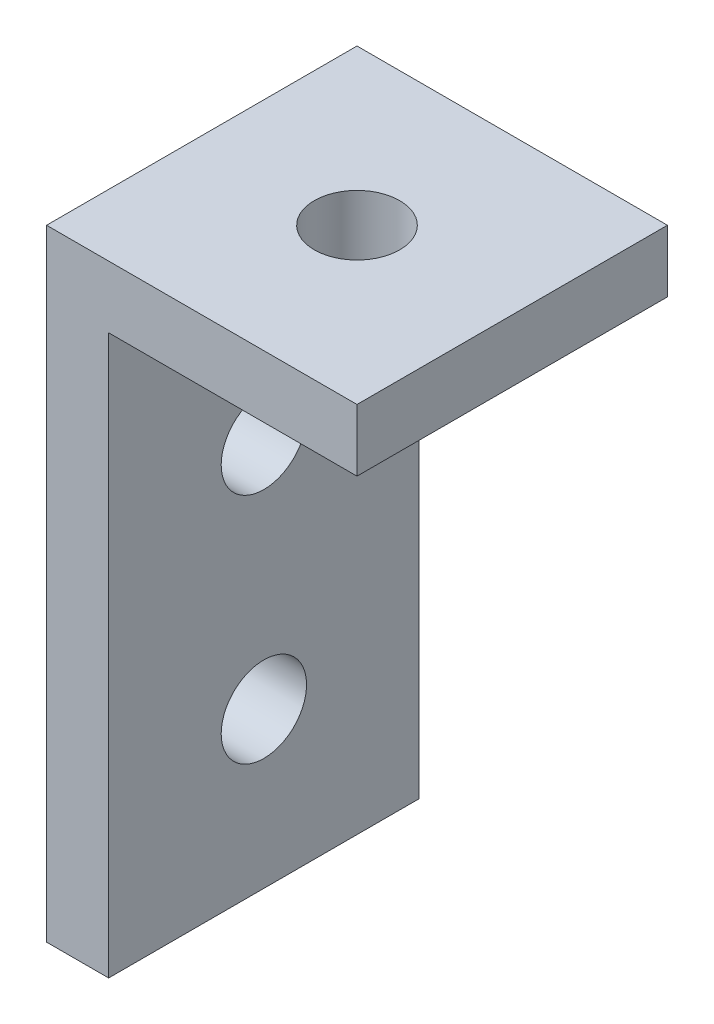
ISO-10303-21;
HEADER;
FILE_DESCRIPTION(('STEP AP214'),'2;1');
FILE_NAME('part.step','',(''),(''),'','','');
FILE_SCHEMA(('AUTOMOTIVE_DESIGN { 1 0 10303 214 1 1 1 1 }'));
ENDSEC;
DATA;
#1=APPLICATION_CONTEXT('core data for automotive mechanical design processes');
#2=APPLICATION_PROTOCOL_DEFINITION('international standard','automotive_design',2000,#1);
#3=PRODUCT_CONTEXT('',#1,'mechanical');
#4=PRODUCT('Part','Part','',(#3));
#5=PRODUCT_RELATED_PRODUCT_CATEGORY('part','',(#4));
#6=PRODUCT_DEFINITION_FORMATION('','',#4);
#7=PRODUCT_DEFINITION_CONTEXT('part definition',#1,'design');
#8=PRODUCT_DEFINITION('design','',#6,#7);
#9=PRODUCT_DEFINITION_SHAPE('','',#8);
#10=(LENGTH_UNIT() NAMED_UNIT(*) SI_UNIT(.MILLI.,.METRE.));
#11=(NAMED_UNIT(*) PLANE_ANGLE_UNIT() SI_UNIT($,.RADIAN.));
#12=(NAMED_UNIT(*) SI_UNIT($,.STERADIAN.) SOLID_ANGLE_UNIT());
#13=UNCERTAINTY_MEASURE_WITH_UNIT(LENGTH_MEASURE(1.E-05),#10,'distance_accuracy_value','');
#14=(GEOMETRIC_REPRESENTATION_CONTEXT(3) GLOBAL_UNCERTAINTY_ASSIGNED_CONTEXT((#13)) GLOBAL_UNIT_ASSIGNED_CONTEXT((#10,
#11,#12)) REPRESENTATION_CONTEXT('',''));
#15=CARTESIAN_POINT('',(0.,0.,0.));
#16=DIRECTION('',(0.,0.,1.));
#17=DIRECTION('',(1.,0.,0.));
#18=AXIS2_PLACEMENT_3D('',#15,#16,#17);
#19=CARTESIAN_POINT('',(0.,40.,20.));
#20=DIRECTION('',(1.,0.,0.));
#21=DIRECTION('',(0.,0.,-1.));
#22=AXIS2_PLACEMENT_3D('',#19,#20,#21);
#23=PLANE('',#22);
#24=CARTESIAN_POINT('',(0.,25.,10.));
#25=DIRECTION('',(-1.,0.,0.));
#26=DIRECTION('',(0.,0.,1.));
#27=AXIS2_PLACEMENT_3D('',#24,#25,#26);
#28=CIRCLE('',#27,2.75);
#29=CARTESIAN_POINT('',(0.,25.,12.75));
#30=VERTEX_POINT('',#29);
#31=EDGE_CURVE('E148',#30,#30,#28,.T.);
#32=ORIENTED_EDGE('',*,*,#31,.F.);
#33=EDGE_LOOP('',(#32));
#34=FACE_BOUND('',#33,.T.);
#35=CARTESIAN_POINT('',(0.,10.,10.));
#36=DIRECTION('',(-1.,0.,0.));
#37=DIRECTION('',(0.,0.,1.));
#38=AXIS2_PLACEMENT_3D('',#35,#36,#37);
#39=CIRCLE('',#38,2.75);
#40=CARTESIAN_POINT('',(0.,10.,12.75));
#41=VERTEX_POINT('',#40);
#42=EDGE_CURVE('E138',#41,#41,#39,.T.);
#43=ORIENTED_EDGE('',*,*,#42,.F.);
#44=EDGE_LOOP('',(#43));
#45=FACE_BOUND('',#44,.T.);
#46=DIRECTION('',(0.,-1.,0.));
#47=VECTOR('',#46,1.);
#48=CARTESIAN_POINT('',(0.,40.,0.));
#49=LINE('',#48,#47);
#50=CARTESIAN_POINT('',(0.,40.,0.));
#51=VERTEX_POINT('',#50);
#52=CARTESIAN_POINT('',(0.,0.,0.));
#53=VERTEX_POINT('',#52);
#54=EDGE_CURVE('E119',#51,#53,#49,.T.);
#55=ORIENTED_EDGE('',*,*,#54,.T.);
#56=DIRECTION('',(0.,0.,-1.));
#57=VECTOR('',#56,1.);
#58=CARTESIAN_POINT('',(0.,0.,20.));
#59=LINE('',#58,#57);
#60=CARTESIAN_POINT('',(0.,0.,20.));
#61=VERTEX_POINT('',#60);
#62=EDGE_CURVE('E11',#61,#53,#59,.T.);
#63=ORIENTED_EDGE('',*,*,#62,.F.);
#64=DIRECTION('',(0.,-1.,0.));
#65=VECTOR('',#64,1.);
#66=CARTESIAN_POINT('',(0.,40.,20.));
#67=LINE('',#66,#65);
#68=CARTESIAN_POINT('',(0.,40.,20.));
#69=VERTEX_POINT('',#68);
#70=EDGE_CURVE('E130',#69,#61,#67,.T.);
#71=ORIENTED_EDGE('',*,*,#70,.F.);
#72=DIRECTION('',(0.,0.,-1.));
#73=VECTOR('',#72,1.);
#74=CARTESIAN_POINT('',(0.,40.,20.));
#75=LINE('',#74,#73);
#76=EDGE_CURVE('E115',#69,#51,#75,.T.);
#77=ORIENTED_EDGE('',*,*,#76,.T.);
#78=EDGE_LOOP('',(#55,#63,#71,#77));
#79=FACE_BOUND('',#78,.T.);
#80=ADVANCED_FACE('F33',(#34,#45,#79),#23,.F.);
#81=CARTESIAN_POINT('',(0.,0.,20.));
#82=DIRECTION('',(0.,1.,0.));
#83=DIRECTION('',(0.,0.,1.));
#84=AXIS2_PLACEMENT_3D('',#81,#82,#83);
#85=PLANE('',#84);
#86=DIRECTION('',(1.,0.,0.));
#87=VECTOR('',#86,1.);
#88=CARTESIAN_POINT('',(0.,0.,0.));
#89=LINE('',#88,#87);
#90=CARTESIAN_POINT('',(4.,0.,0.));
#91=VERTEX_POINT('',#90);
#92=EDGE_CURVE('E122',#53,#91,#89,.T.);
#93=ORIENTED_EDGE('',*,*,#92,.T.);
#94=DIRECTION('',(0.,0.,-1.));
#95=VECTOR('',#94,1.);
#96=CARTESIAN_POINT('',(4.,0.,20.));
#97=LINE('',#96,#95);
#98=CARTESIAN_POINT('',(4.,0.,20.));
#99=VERTEX_POINT('',#98);
#100=EDGE_CURVE('E42',#99,#91,#97,.T.);
#101=ORIENTED_EDGE('',*,*,#100,.F.);
#102=DIRECTION('',(1.,0.,0.));
#103=VECTOR('',#102,1.);
#104=CARTESIAN_POINT('',(0.,0.,20.));
#105=LINE('',#104,#103);
#106=EDGE_CURVE('E88',#61,#99,#105,.T.);
#107=ORIENTED_EDGE('',*,*,#106,.F.);
#108=ORIENTED_EDGE('',*,*,#62,.T.);
#109=EDGE_LOOP('',(#93,#101,#107,#108));
#110=FACE_BOUND('',#109,.T.);
#111=ADVANCED_FACE('F156',(#110),#85,.F.);
#112=CARTESIAN_POINT('',(4.,0.,20.));
#113=DIRECTION('',(-1.,0.,0.));
#114=DIRECTION('',(0.,-1.,0.));
#115=AXIS2_PLACEMENT_3D('',#112,#113,#114);
#116=PLANE('',#115);
#117=CARTESIAN_POINT('',(4.,25.,10.));
#118=DIRECTION('',(-1.,0.,0.));
#119=DIRECTION('',(0.,-1.,0.));
#120=AXIS2_PLACEMENT_3D('',#117,#118,#119);
#121=CIRCLE('',#120,2.75);
#122=CARTESIAN_POINT('',(4.,22.25,10.));
#123=VERTEX_POINT('',#122);
#124=EDGE_CURVE('E36',#123,#123,#121,.T.);
#125=ORIENTED_EDGE('',*,*,#124,.T.);
#126=EDGE_LOOP('',(#125));
#127=FACE_BOUND('',#126,.T.);
#128=CARTESIAN_POINT('',(4.,10.,10.));
#129=DIRECTION('',(-1.,0.,0.));
#130=DIRECTION('',(0.,-1.,0.));
#131=AXIS2_PLACEMENT_3D('',#128,#129,#130);
#132=CIRCLE('',#131,2.75);
#133=CARTESIAN_POINT('',(4.,7.25,10.));
#134=VERTEX_POINT('',#133);
#135=EDGE_CURVE('E135',#134,#134,#132,.T.);
#136=ORIENTED_EDGE('',*,*,#135,.T.);
#137=EDGE_LOOP('',(#136));
#138=FACE_BOUND('',#137,.T.);
#139=DIRECTION('',(0.,1.,0.));
#140=VECTOR('',#139,1.);
#141=CARTESIAN_POINT('',(4.,0.,0.));
#142=LINE('',#141,#140);
#143=CARTESIAN_POINT('',(4.,36.,0.));
#144=VERTEX_POINT('',#143);
#145=EDGE_CURVE('E125',#91,#144,#142,.T.);
#146=ORIENTED_EDGE('',*,*,#145,.T.);
#147=DIRECTION('',(0.,0.,-1.));
#148=VECTOR('',#147,1.);
#149=CARTESIAN_POINT('',(4.,36.,20.));
#150=LINE('',#149,#148);
#151=CARTESIAN_POINT('',(4.,36.,20.));
#152=VERTEX_POINT('',#151);
#153=EDGE_CURVE('E110',#152,#144,#150,.T.);
#154=ORIENTED_EDGE('',*,*,#153,.F.);
#155=DIRECTION('',(0.,1.,0.));
#156=VECTOR('',#155,1.);
#157=CARTESIAN_POINT('',(4.,0.,20.));
#158=LINE('',#157,#156);
#159=EDGE_CURVE('E101',#99,#152,#158,.T.);
#160=ORIENTED_EDGE('',*,*,#159,.F.);
#161=ORIENTED_EDGE('',*,*,#100,.T.);
#162=EDGE_LOOP('',(#146,#154,#160,#161));
#163=FACE_BOUND('',#162,.T.);
#164=ADVANCED_FACE('F159',(#127,#138,#163),#116,.F.);
#165=CARTESIAN_POINT('',(4.,36.,20.));
#166=DIRECTION('',(0.,1.,0.));
#167=DIRECTION('',(0.,0.,1.));
#168=AXIS2_PLACEMENT_3D('',#165,#166,#167);
#169=PLANE('',#168);
#170=CARTESIAN_POINT('',(10.,36.,10.));
#171=DIRECTION('',(0.,1.,0.));
#172=DIRECTION('',(0.,0.,1.));
#173=AXIS2_PLACEMENT_3D('',#170,#171,#172);
#174=CIRCLE('',#173,2.74999999999999);
#175=CARTESIAN_POINT('',(10.,36.,12.75));
#176=VERTEX_POINT('',#175);
#177=EDGE_CURVE('E123',#176,#176,#174,.T.);
#178=ORIENTED_EDGE('',*,*,#177,.T.);
#179=EDGE_LOOP('',(#178));
#180=FACE_BOUND('',#179,.T.);
#181=DIRECTION('',(1.,0.,0.));
#182=VECTOR('',#181,1.);
#183=CARTESIAN_POINT('',(4.,36.,0.));
#184=LINE('',#183,#182);
#185=CARTESIAN_POINT('',(20.,36.,0.));
#186=VERTEX_POINT('',#185);
#187=EDGE_CURVE('E109',#144,#186,#184,.T.);
#188=ORIENTED_EDGE('',*,*,#187,.T.);
#189=DIRECTION('',(0.,0.,-1.));
#190=VECTOR('',#189,1.);
#191=CARTESIAN_POINT('',(20.,36.,20.));
#192=LINE('',#191,#190);
#193=CARTESIAN_POINT('',(20.,36.,20.));
#194=VERTEX_POINT('',#193);
#195=EDGE_CURVE('E106',#194,#186,#192,.T.);
#196=ORIENTED_EDGE('',*,*,#195,.F.);
#197=DIRECTION('',(1.,0.,0.));
#198=VECTOR('',#197,1.);
#199=CARTESIAN_POINT('',(4.,36.,20.));
#200=LINE('',#199,#198);
#201=EDGE_CURVE('E95',#152,#194,#200,.T.);
#202=ORIENTED_EDGE('',*,*,#201,.F.);
#203=ORIENTED_EDGE('',*,*,#153,.T.);
#204=EDGE_LOOP('',(#188,#196,#202,#203));
#205=FACE_BOUND('',#204,.T.);
#206=ADVANCED_FACE('F107',(#180,#205),#169,.F.);
#207=CARTESIAN_POINT('',(20.,36.,20.));
#208=DIRECTION('',(-1.,0.,0.));
#209=DIRECTION('',(0.,0.,1.));
#210=AXIS2_PLACEMENT_3D('',#207,#208,#209);
#211=PLANE('',#210);
#212=DIRECTION('',(0.,1.,0.));
#213=VECTOR('',#212,1.);
#214=CARTESIAN_POINT('',(20.,36.,0.));
#215=LINE('',#214,#213);
#216=CARTESIAN_POINT('',(20.,40.,0.));
#217=VERTEX_POINT('',#216);
#218=EDGE_CURVE('E74',#186,#217,#215,.T.);
#219=ORIENTED_EDGE('',*,*,#218,.T.);
#220=DIRECTION('',(0.,0.,-1.));
#221=VECTOR('',#220,1.);
#222=CARTESIAN_POINT('',(20.,40.,20.));
#223=LINE('',#222,#221);
#224=CARTESIAN_POINT('',(20.,40.,20.));
#225=VERTEX_POINT('',#224);
#226=EDGE_CURVE('E111',#225,#217,#223,.T.);
#227=ORIENTED_EDGE('',*,*,#226,.F.);
#228=DIRECTION('',(0.,1.,0.));
#229=VECTOR('',#228,1.);
#230=CARTESIAN_POINT('',(20.,36.,20.));
#231=LINE('',#230,#229);
#232=EDGE_CURVE('E99',#194,#225,#231,.T.);
#233=ORIENTED_EDGE('',*,*,#232,.F.);
#234=ORIENTED_EDGE('',*,*,#195,.T.);
#235=EDGE_LOOP('',(#219,#227,#233,#234));
#236=FACE_BOUND('',#235,.T.);
#237=ADVANCED_FACE('F113',(#236),#211,.F.);
#238=CARTESIAN_POINT('',(20.,40.,20.));
#239=DIRECTION('',(0.,-1.,0.));
#240=DIRECTION('',(0.,0.,-1.));
#241=AXIS2_PLACEMENT_3D('',#238,#239,#240);
#242=PLANE('',#241);
#243=CARTESIAN_POINT('',(10.,40.,10.));
#244=DIRECTION('',(0.,1.,0.));
#245=DIRECTION('',(0.,0.,1.));
#246=AXIS2_PLACEMENT_3D('',#243,#244,#245);
#247=CIRCLE('',#246,2.74999999999999);
#248=CARTESIAN_POINT('',(10.,40.,12.75));
#249=VERTEX_POINT('',#248);
#250=EDGE_CURVE('E137',#249,#249,#247,.T.);
#251=ORIENTED_EDGE('',*,*,#250,.F.);
#252=EDGE_LOOP('',(#251));
#253=FACE_BOUND('',#252,.T.);
#254=DIRECTION('',(-1.,0.,0.));
#255=VECTOR('',#254,1.);
#256=CARTESIAN_POINT('',(20.,40.,0.));
#257=LINE('',#256,#255);
#258=EDGE_CURVE('E80',#217,#51,#257,.T.);
#259=ORIENTED_EDGE('',*,*,#258,.T.);
#260=ORIENTED_EDGE('',*,*,#76,.F.);
#261=DIRECTION('',(-1.,0.,0.));
#262=VECTOR('',#261,1.);
#263=CARTESIAN_POINT('',(20.,40.,20.));
#264=LINE('',#263,#262);
#265=EDGE_CURVE('E51',#225,#69,#264,.T.);
#266=ORIENTED_EDGE('',*,*,#265,.F.);
#267=ORIENTED_EDGE('',*,*,#226,.T.);
#268=EDGE_LOOP('',(#259,#260,#266,#267));
#269=FACE_BOUND('',#268,.T.);
#270=ADVANCED_FACE('F164',(#253,#269),#242,.F.);
#271=CARTESIAN_POINT('',(0.,0.,20.));
#272=DIRECTION('',(0.,0.,1.));
#273=DIRECTION('',(1.,0.,0.));
#274=AXIS2_PLACEMENT_3D('',#271,#272,#273);
#275=PLANE('',#274);
#276=ORIENTED_EDGE('',*,*,#70,.T.);
#277=ORIENTED_EDGE('',*,*,#106,.T.);
#278=ORIENTED_EDGE('',*,*,#159,.T.);
#279=ORIENTED_EDGE('',*,*,#201,.T.);
#280=ORIENTED_EDGE('',*,*,#232,.T.);
#281=ORIENTED_EDGE('',*,*,#265,.T.);
#282=EDGE_LOOP('',(#276,#277,#278,#279,#280,#281));
#283=FACE_BOUND('',#282,.T.);
#284=ADVANCED_FACE('F97',(#283),#275,.T.);
#285=CARTESIAN_POINT('',(0.,0.,0.));
#286=DIRECTION('',(0.,0.,1.));
#287=DIRECTION('',(1.,0.,0.));
#288=AXIS2_PLACEMENT_3D('',#285,#286,#287);
#289=PLANE('',#288);
#290=ORIENTED_EDGE('',*,*,#54,.F.);
#291=ORIENTED_EDGE('',*,*,#258,.F.);
#292=ORIENTED_EDGE('',*,*,#218,.F.);
#293=ORIENTED_EDGE('',*,*,#187,.F.);
#294=ORIENTED_EDGE('',*,*,#145,.F.);
#295=ORIENTED_EDGE('',*,*,#92,.F.);
#296=EDGE_LOOP('',(#290,#291,#292,#293,#294,#295));
#297=FACE_BOUND('',#296,.T.);
#298=ADVANCED_FACE('F162',(#297),#289,.F.);
#299=CARTESIAN_POINT('',(10.,0.,10.));
#300=DIRECTION('',(0.,1.,0.));
#301=DIRECTION('',(0.,0.,1.));
#302=AXIS2_PLACEMENT_3D('',#299,#300,#301);
#303=CYLINDRICAL_SURFACE('',#302,2.74999999999999);
#304=ORIENTED_EDGE('',*,*,#250,.T.);
#305=EDGE_LOOP('',(#304));
#306=FACE_BOUND('',#305,.T.);
#307=ORIENTED_EDGE('',*,*,#177,.F.);
#308=EDGE_LOOP('',(#307));
#309=FACE_BOUND('',#308,.T.);
#310=ADVANCED_FACE('F203',(#306,#309),#303,.F.);
#311=CARTESIAN_POINT('',(20.,10.,10.));
#312=DIRECTION('',(-1.,0.,0.));
#313=DIRECTION('',(0.,0.,1.));
#314=AXIS2_PLACEMENT_3D('',#311,#312,#313);
#315=CYLINDRICAL_SURFACE('',#314,2.75);
#316=ORIENTED_EDGE('',*,*,#42,.T.);
#317=EDGE_LOOP('',(#316));
#318=FACE_BOUND('',#317,.T.);
#319=ORIENTED_EDGE('',*,*,#135,.F.);
#320=EDGE_LOOP('',(#319));
#321=FACE_BOUND('',#320,.T.);
#322=ADVANCED_FACE('F188',(#318,#321),#315,.F.);
#323=CARTESIAN_POINT('',(20.,25.,10.));
#324=DIRECTION('',(-1.,0.,0.));
#325=DIRECTION('',(0.,0.,1.));
#326=AXIS2_PLACEMENT_3D('',#323,#324,#325);
#327=CYLINDRICAL_SURFACE('',#326,2.75);
#328=ORIENTED_EDGE('',*,*,#31,.T.);
#329=EDGE_LOOP('',(#328));
#330=FACE_BOUND('',#329,.T.);
#331=ORIENTED_EDGE('',*,*,#124,.F.);
#332=EDGE_LOOP('',(#331));
#333=FACE_BOUND('',#332,.T.);
#334=ADVANCED_FACE('F185',(#330,#333),#327,.F.);
#335=CLOSED_SHELL('',(#80,#111,#164,#206,#237,#270,#284,#298,#310,#322,#334));
#336=MANIFOLD_SOLID_BREP('B2',#335);
#337=ADVANCED_BREP_SHAPE_REPRESENTATION('',(#18,#336),#14);
#338=SHAPE_DEFINITION_REPRESENTATION(#9,#337);
ENDSEC;
END-ISO-10303-21;
